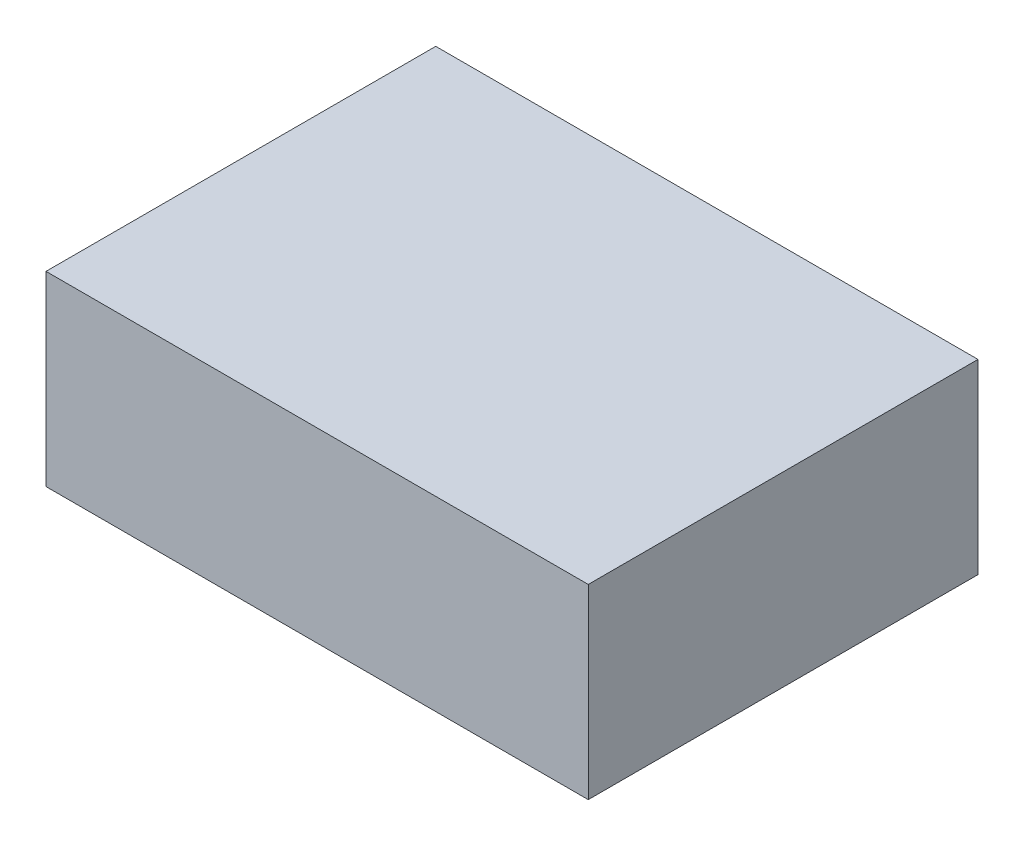
ISO-10303-21;
HEADER;
FILE_DESCRIPTION(('STEP AP214'),'2;1');
FILE_NAME('part.step','',(''),(''),'','','');
FILE_SCHEMA(('AUTOMOTIVE_DESIGN { 1 0 10303 214 1 1 1 1 }'));
ENDSEC;
DATA;
#1=APPLICATION_CONTEXT('core data for automotive mechanical design processes');
#2=APPLICATION_PROTOCOL_DEFINITION('international standard','automotive_design',2000,#1);
#3=PRODUCT_CONTEXT('',#1,'mechanical');
#4=PRODUCT('Part','Part','',(#3));
#5=PRODUCT_RELATED_PRODUCT_CATEGORY('part','',(#4));
#6=PRODUCT_DEFINITION_FORMATION('','',#4);
#7=PRODUCT_DEFINITION_CONTEXT('part definition',#1,'design');
#8=PRODUCT_DEFINITION('design','',#6,#7);
#9=PRODUCT_DEFINITION_SHAPE('','',#8);
#10=(LENGTH_UNIT() NAMED_UNIT(*) SI_UNIT(.MILLI.,.METRE.));
#11=(NAMED_UNIT(*) PLANE_ANGLE_UNIT() SI_UNIT($,.RADIAN.));
#12=(NAMED_UNIT(*) SI_UNIT($,.STERADIAN.) SOLID_ANGLE_UNIT());
#13=UNCERTAINTY_MEASURE_WITH_UNIT(LENGTH_MEASURE(1.E-05),#10,'distance_accuracy_value','');
#14=(GEOMETRIC_REPRESENTATION_CONTEXT(3) GLOBAL_UNCERTAINTY_ASSIGNED_CONTEXT((#13)) GLOBAL_UNIT_ASSIGNED_CONTEXT((#10,
#11,#12)) REPRESENTATION_CONTEXT('',''));
#15=CARTESIAN_POINT('',(0.,0.,0.));
#16=DIRECTION('',(0.,0.,1.));
#17=DIRECTION('',(1.,0.,0.));
#18=AXIS2_PLACEMENT_3D('',#15,#16,#17);
#19=CARTESIAN_POINT('',(32.,22.,23.));
#20=DIRECTION('',(-1.,0.,0.));
#21=DIRECTION('',(0.,0.,1.));
#22=AXIS2_PLACEMENT_3D('',#19,#20,#21);
#23=PLANE('',#22);
#24=DIRECTION('',(0.,0.,-1.));
#25=VECTOR('',#24,1.);
#26=CARTESIAN_POINT('',(32.,0.,23.));
#27=LINE('',#26,#25);
#28=CARTESIAN_POINT('',(32.,0.,23.));
#29=VERTEX_POINT('',#28);
#30=CARTESIAN_POINT('',(32.,0.,-23.));
#31=VERTEX_POINT('',#30);
#32=EDGE_CURVE('E100',#29,#31,#27,.T.);
#33=ORIENTED_EDGE('',*,*,#32,.T.);
#34=DIRECTION('',(0.,-1.,0.));
#35=VECTOR('',#34,1.);
#36=CARTESIAN_POINT('',(32.,22.,-23.));
#37=LINE('',#36,#35);
#38=CARTESIAN_POINT('',(32.,22.,-23.));
#39=VERTEX_POINT('',#38);
#40=EDGE_CURVE('E11',#39,#31,#37,.T.);
#41=ORIENTED_EDGE('',*,*,#40,.F.);
#42=DIRECTION('',(0.,0.,-1.));
#43=VECTOR('',#42,1.);
#44=CARTESIAN_POINT('',(32.,22.,23.));
#45=LINE('',#44,#43);
#46=CARTESIAN_POINT('',(32.,22.,23.));
#47=VERTEX_POINT('',#46);
#48=EDGE_CURVE('E88',#47,#39,#45,.T.);
#49=ORIENTED_EDGE('',*,*,#48,.F.);
#50=DIRECTION('',(0.,-1.,0.));
#51=VECTOR('',#50,1.);
#52=CARTESIAN_POINT('',(32.,22.,23.));
#53=LINE('',#52,#51);
#54=EDGE_CURVE('E96',#47,#29,#53,.T.);
#55=ORIENTED_EDGE('',*,*,#54,.T.);
#56=EDGE_LOOP('',(#33,#41,#49,#55));
#57=FACE_BOUND('',#56,.T.);
#58=ADVANCED_FACE('F37',(#57),#23,.F.);
#59=CARTESIAN_POINT('',(-32.,22.,-23.));
#60=DIRECTION('',(0.,0.,1.));
#61=DIRECTION('',(1.,0.,0.));
#62=AXIS2_PLACEMENT_3D('',#59,#60,#61);
#63=PLANE('',#62);
#64=DIRECTION('',(-1.,0.,0.));
#65=VECTOR('',#64,1.);
#66=CARTESIAN_POINT('',(-32.,0.,-23.));
#67=LINE('',#66,#65);
#68=CARTESIAN_POINT('',(-32.,0.,-23.));
#69=VERTEX_POINT('',#68);
#70=EDGE_CURVE('E92',#31,#69,#67,.T.);
#71=ORIENTED_EDGE('',*,*,#70,.T.);
#72=DIRECTION('',(0.,-1.,0.));
#73=VECTOR('',#72,1.);
#74=CARTESIAN_POINT('',(-32.,22.,-23.));
#75=LINE('',#74,#73);
#76=CARTESIAN_POINT('',(-32.,22.,-23.));
#77=VERTEX_POINT('',#76);
#78=EDGE_CURVE('E45',#77,#69,#75,.T.);
#79=ORIENTED_EDGE('',*,*,#78,.F.);
#80=DIRECTION('',(-1.,0.,0.));
#81=VECTOR('',#80,1.);
#82=CARTESIAN_POINT('',(-32.,22.,-23.));
#83=LINE('',#82,#81);
#84=EDGE_CURVE('E83',#39,#77,#83,.T.);
#85=ORIENTED_EDGE('',*,*,#84,.F.);
#86=ORIENTED_EDGE('',*,*,#40,.T.);
#87=EDGE_LOOP('',(#71,#79,#85,#86));
#88=FACE_BOUND('',#87,.T.);
#89=ADVANCED_FACE('F91',(#88),#63,.F.);
#90=CARTESIAN_POINT('',(-32.,22.,23.));
#91=DIRECTION('',(1.,0.,0.));
#92=DIRECTION('',(0.,0.,-1.));
#93=AXIS2_PLACEMENT_3D('',#90,#91,#92);
#94=PLANE('',#93);
#95=DIRECTION('',(0.,0.,1.));
#96=VECTOR('',#95,1.);
#97=CARTESIAN_POINT('',(-32.,0.,23.));
#98=LINE('',#97,#96);
#99=CARTESIAN_POINT('',(-32.,0.,23.));
#100=VERTEX_POINT('',#99);
#101=EDGE_CURVE('E70',#69,#100,#98,.T.);
#102=ORIENTED_EDGE('',*,*,#101,.T.);
#103=DIRECTION('',(0.,-1.,0.));
#104=VECTOR('',#103,1.);
#105=CARTESIAN_POINT('',(-32.,22.,23.));
#106=LINE('',#105,#104);
#107=CARTESIAN_POINT('',(-32.,22.,23.));
#108=VERTEX_POINT('',#107);
#109=EDGE_CURVE('E93',#108,#100,#106,.T.);
#110=ORIENTED_EDGE('',*,*,#109,.F.);
#111=DIRECTION('',(0.,0.,1.));
#112=VECTOR('',#111,1.);
#113=CARTESIAN_POINT('',(-32.,22.,23.));
#114=LINE('',#113,#112);
#115=EDGE_CURVE('E86',#77,#108,#114,.T.);
#116=ORIENTED_EDGE('',*,*,#115,.F.);
#117=ORIENTED_EDGE('',*,*,#78,.T.);
#118=EDGE_LOOP('',(#102,#110,#116,#117));
#119=FACE_BOUND('',#118,.T.);
#120=ADVANCED_FACE('F94',(#119),#94,.F.);
#121=CARTESIAN_POINT('',(-32.,22.,23.));
#122=DIRECTION('',(0.,0.,-1.));
#123=DIRECTION('',(-1.,0.,0.));
#124=AXIS2_PLACEMENT_3D('',#121,#122,#123);
#125=PLANE('',#124);
#126=DIRECTION('',(1.,0.,0.));
#127=VECTOR('',#126,1.);
#128=CARTESIAN_POINT('',(-32.,0.,23.));
#129=LINE('',#128,#127);
#130=EDGE_CURVE('E76',#100,#29,#129,.T.);
#131=ORIENTED_EDGE('',*,*,#130,.T.);
#132=ORIENTED_EDGE('',*,*,#54,.F.);
#133=DIRECTION('',(1.,0.,0.));
#134=VECTOR('',#133,1.);
#135=CARTESIAN_POINT('',(-32.,22.,23.));
#136=LINE('',#135,#134);
#137=EDGE_CURVE('E53',#108,#47,#136,.T.);
#138=ORIENTED_EDGE('',*,*,#137,.F.);
#139=ORIENTED_EDGE('',*,*,#109,.T.);
#140=EDGE_LOOP('',(#131,#132,#138,#139));
#141=FACE_BOUND('',#140,.T.);
#142=ADVANCED_FACE('F107',(#141),#125,.F.);
#143=CARTESIAN_POINT('',(0.,22.,0.));
#144=DIRECTION('',(0.,-1.,0.));
#145=DIRECTION('',(0.,0.,-1.));
#146=AXIS2_PLACEMENT_3D('',#143,#144,#145);
#147=PLANE('',#146);
#148=ORIENTED_EDGE('',*,*,#48,.T.);
#149=ORIENTED_EDGE('',*,*,#84,.T.);
#150=ORIENTED_EDGE('',*,*,#115,.T.);
#151=ORIENTED_EDGE('',*,*,#137,.T.);
#152=EDGE_LOOP('',(#148,#149,#150,#151));
#153=FACE_BOUND('',#152,.T.);
#154=ADVANCED_FACE('F84',(#153),#147,.F.);
#155=CARTESIAN_POINT('',(0.,0.,0.));
#156=DIRECTION('',(0.,-1.,0.));
#157=DIRECTION('',(0.,0.,-1.));
#158=AXIS2_PLACEMENT_3D('',#155,#156,#157);
#159=PLANE('',#158);
#160=ORIENTED_EDGE('',*,*,#32,.F.);
#161=ORIENTED_EDGE('',*,*,#130,.F.);
#162=ORIENTED_EDGE('',*,*,#101,.F.);
#163=ORIENTED_EDGE('',*,*,#70,.F.);
#164=EDGE_LOOP('',(#160,#161,#162,#163));
#165=FACE_BOUND('',#164,.T.);
#166=ADVANCED_FACE('F110',(#165),#159,.T.);
#167=CLOSED_SHELL('',(#58,#89,#120,#142,#154,#166));
#168=MANIFOLD_SOLID_BREP('B2',#167);
#169=ADVANCED_BREP_SHAPE_REPRESENTATION('',(#18,#168),#14);
#170=SHAPE_DEFINITION_REPRESENTATION(#9,#169);
ENDSEC;
END-ISO-10303-21;
